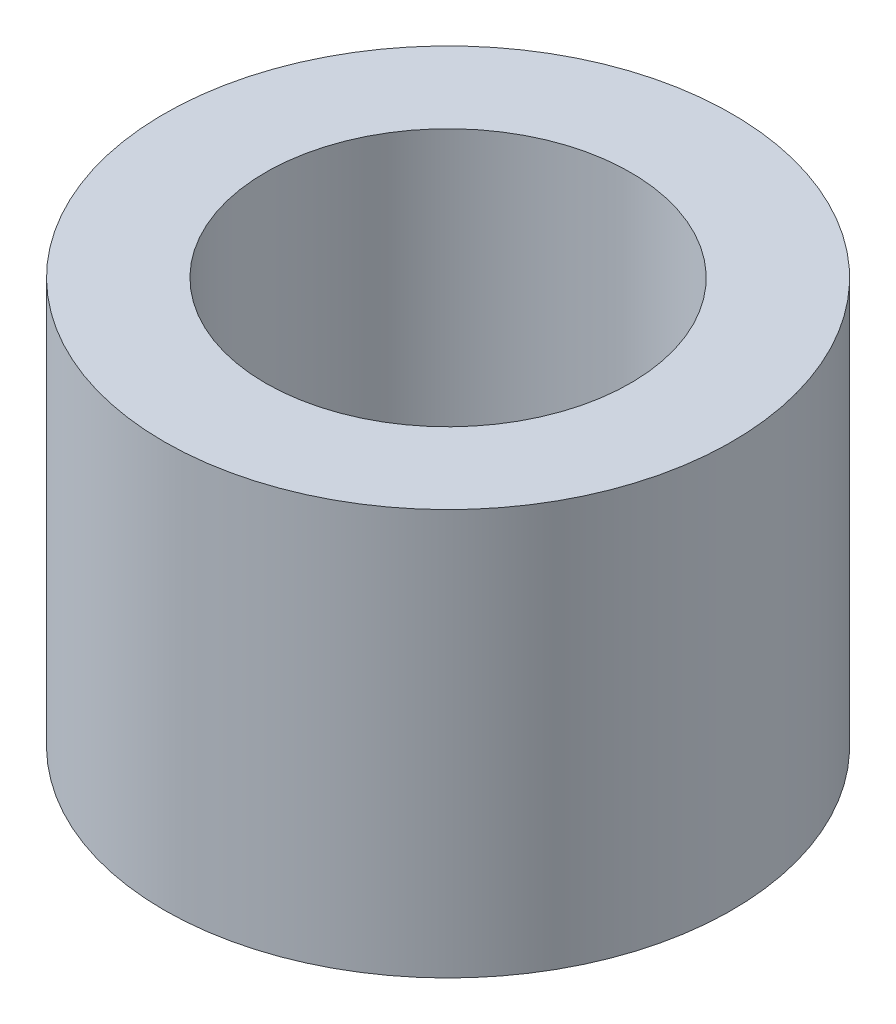
ISO-10303-21;
HEADER;
FILE_DESCRIPTION(('STEP AP214'),'2;1');
FILE_NAME('part.step','',(''),(''),'','','');
FILE_SCHEMA(('AUTOMOTIVE_DESIGN { 1 0 10303 214 1 1 1 1 }'));
ENDSEC;
DATA;
#1=APPLICATION_CONTEXT('core data for automotive mechanical design processes');
#2=APPLICATION_PROTOCOL_DEFINITION('international standard','automotive_design',2000,#1);
#3=PRODUCT_CONTEXT('',#1,'mechanical');
#4=PRODUCT('Part','Part','',(#3));
#5=PRODUCT_RELATED_PRODUCT_CATEGORY('part','',(#4));
#6=PRODUCT_DEFINITION_FORMATION('','',#4);
#7=PRODUCT_DEFINITION_CONTEXT('part definition',#1,'design');
#8=PRODUCT_DEFINITION('design','',#6,#7);
#9=PRODUCT_DEFINITION_SHAPE('','',#8);
#10=(LENGTH_UNIT() NAMED_UNIT(*) SI_UNIT(.MILLI.,.METRE.));
#11=(NAMED_UNIT(*) PLANE_ANGLE_UNIT() SI_UNIT($,.RADIAN.));
#12=(NAMED_UNIT(*) SI_UNIT($,.STERADIAN.) SOLID_ANGLE_UNIT());
#13=UNCERTAINTY_MEASURE_WITH_UNIT(LENGTH_MEASURE(1.E-05),#10,'distance_accuracy_value','');
#14=(GEOMETRIC_REPRESENTATION_CONTEXT(3) GLOBAL_UNCERTAINTY_ASSIGNED_CONTEXT((#13)) GLOBAL_UNIT_ASSIGNED_CONTEXT((#10,
#11,#12)) REPRESENTATION_CONTEXT('',''));
#15=CARTESIAN_POINT('',(0.,0.,0.));
#16=DIRECTION('',(0.,0.,1.));
#17=DIRECTION('',(1.,0.,0.));
#18=AXIS2_PLACEMENT_3D('',#15,#16,#17);
#19=CARTESIAN_POINT('',(0.,5.,0.));
#20=DIRECTION('',(0.,-1.,0.));
#21=DIRECTION('',(0.,0.,-1.));
#22=AXIS2_PLACEMENT_3D('',#19,#20,#21);
#23=CYLINDRICAL_SURFACE('',#22,3.5);
#24=CARTESIAN_POINT('',(0.,5.,0.));
#25=DIRECTION('',(0.,1.,0.));
#26=DIRECTION('',(0.,0.,1.));
#27=AXIS2_PLACEMENT_3D('',#24,#25,#26);
#28=CIRCLE('',#27,3.5);
#29=CARTESIAN_POINT('',(0.,5.,3.5));
#30=VERTEX_POINT('',#29);
#31=EDGE_CURVE('E10',#30,#30,#28,.T.);
#32=ORIENTED_EDGE('',*,*,#31,.F.);
#33=EDGE_LOOP('',(#32));
#34=FACE_BOUND('',#33,.T.);
#35=CARTESIAN_POINT('',(0.,0.,0.));
#36=DIRECTION('',(0.,1.,0.));
#37=DIRECTION('',(0.,0.,1.));
#38=AXIS2_PLACEMENT_3D('',#35,#36,#37);
#39=CIRCLE('',#38,3.5);
#40=CARTESIAN_POINT('',(0.,0.,3.5));
#41=VERTEX_POINT('',#40);
#42=EDGE_CURVE('E38',#41,#41,#39,.T.);
#43=ORIENTED_EDGE('',*,*,#42,.T.);
#44=EDGE_LOOP('',(#43));
#45=FACE_BOUND('',#44,.T.);
#46=ADVANCED_FACE('F35',(#34,#45),#23,.T.);
#47=CARTESIAN_POINT('',(0.,5.,0.));
#48=DIRECTION('',(0.,1.,0.));
#49=DIRECTION('',(0.,0.,1.));
#50=AXIS2_PLACEMENT_3D('',#47,#48,#49);
#51=PLANE('',#50);
#52=CARTESIAN_POINT('',(0.,5.,0.));
#53=DIRECTION('',(0.,1.,0.));
#54=DIRECTION('',(0.,0.,1.));
#55=AXIS2_PLACEMENT_3D('',#52,#53,#54);
#56=CIRCLE('',#55,2.25);
#57=CARTESIAN_POINT('',(0.,5.,2.25));
#58=VERTEX_POINT('',#57);
#59=EDGE_CURVE('E47',#58,#58,#56,.T.);
#60=ORIENTED_EDGE('',*,*,#59,.F.);
#61=EDGE_LOOP('',(#60));
#62=FACE_BOUND('',#61,.T.);
#63=ORIENTED_EDGE('',*,*,#31,.T.);
#64=EDGE_LOOP('',(#63));
#65=FACE_BOUND('',#64,.T.);
#66=ADVANCED_FACE('F62',(#62,#65),#51,.T.);
#67=CARTESIAN_POINT('',(0.,0.,0.));
#68=DIRECTION('',(0.,1.,0.));
#69=DIRECTION('',(0.,0.,1.));
#70=AXIS2_PLACEMENT_3D('',#67,#68,#69);
#71=PLANE('',#70);
#72=CARTESIAN_POINT('',(0.,0.,0.));
#73=DIRECTION('',(0.,1.,0.));
#74=DIRECTION('',(0.,0.,1.));
#75=AXIS2_PLACEMENT_3D('',#72,#73,#74);
#76=CIRCLE('',#75,2.25);
#77=CARTESIAN_POINT('',(0.,0.,2.25));
#78=VERTEX_POINT('',#77);
#79=EDGE_CURVE('E45',#78,#78,#76,.T.);
#80=ORIENTED_EDGE('',*,*,#79,.T.);
#81=EDGE_LOOP('',(#80));
#82=FACE_BOUND('',#81,.T.);
#83=ORIENTED_EDGE('',*,*,#42,.F.);
#84=EDGE_LOOP('',(#83));
#85=FACE_BOUND('',#84,.T.);
#86=ADVANCED_FACE('F53',(#82,#85),#71,.F.);
#87=CARTESIAN_POINT('',(0.,0.,0.));
#88=DIRECTION('',(0.,1.,0.));
#89=DIRECTION('',(0.,0.,1.));
#90=AXIS2_PLACEMENT_3D('',#87,#88,#89);
#91=CYLINDRICAL_SURFACE('',#90,2.25);
#92=ORIENTED_EDGE('',*,*,#79,.F.);
#93=EDGE_LOOP('',(#92));
#94=FACE_BOUND('',#93,.T.);
#95=ORIENTED_EDGE('',*,*,#59,.T.);
#96=EDGE_LOOP('',(#95));
#97=FACE_BOUND('',#96,.T.);
#98=ADVANCED_FACE('F56',(#94,#97),#91,.F.);
#99=CLOSED_SHELL('',(#46,#66,#86,#98));
#100=MANIFOLD_SOLID_BREP('B2',#99);
#101=ADVANCED_BREP_SHAPE_REPRESENTATION('',(#18,#100),#14);
#102=SHAPE_DEFINITION_REPRESENTATION(#9,#101);
ENDSEC;
END-ISO-10303-21;
